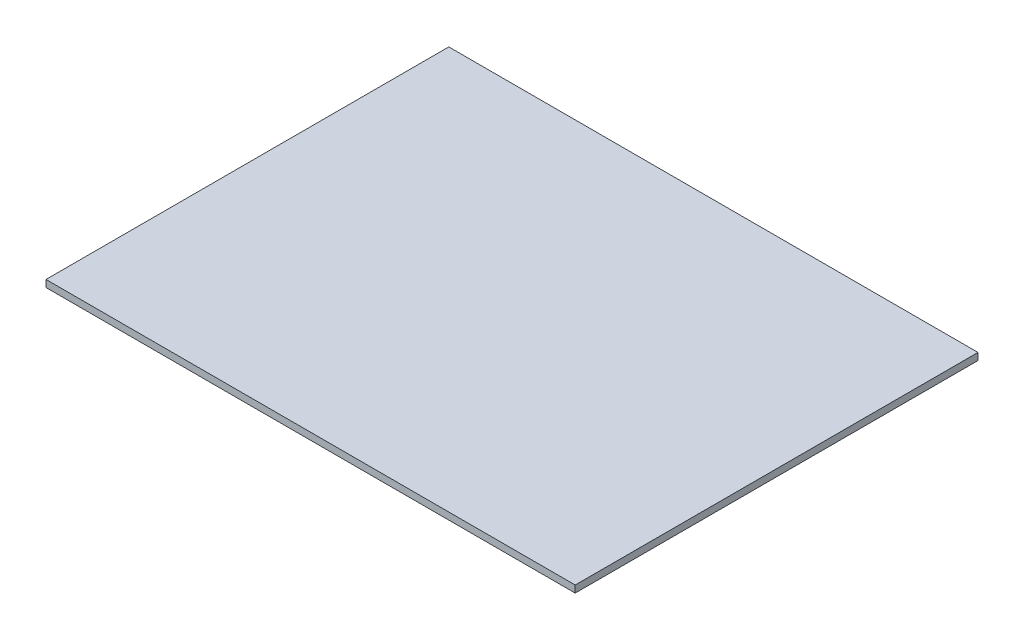
ISO-10303-21;
HEADER;
FILE_DESCRIPTION(('STEP AP214'),'2;1');
FILE_NAME('part.step','',(''),(''),'','','');
FILE_SCHEMA(('AUTOMOTIVE_DESIGN { 1 0 10303 214 1 1 1 1 }'));
ENDSEC;
DATA;
#1=APPLICATION_CONTEXT('core data for automotive mechanical design processes');
#2=APPLICATION_PROTOCOL_DEFINITION('international standard','automotive_design',2000,#1);
#3=PRODUCT_CONTEXT('',#1,'mechanical');
#4=PRODUCT('Part','Part','',(#3));
#5=PRODUCT_RELATED_PRODUCT_CATEGORY('part','',(#4));
#6=PRODUCT_DEFINITION_FORMATION('','',#4);
#7=PRODUCT_DEFINITION_CONTEXT('part definition',#1,'design');
#8=PRODUCT_DEFINITION('design','',#6,#7);
#9=PRODUCT_DEFINITION_SHAPE('','',#8);
#10=(LENGTH_UNIT() NAMED_UNIT(*) SI_UNIT(.MILLI.,.METRE.));
#11=(NAMED_UNIT(*) PLANE_ANGLE_UNIT() SI_UNIT($,.RADIAN.));
#12=(NAMED_UNIT(*) SI_UNIT($,.STERADIAN.) SOLID_ANGLE_UNIT());
#13=UNCERTAINTY_MEASURE_WITH_UNIT(LENGTH_MEASURE(1.E-05),#10,'distance_accuracy_value','');
#14=(GEOMETRIC_REPRESENTATION_CONTEXT(3) GLOBAL_UNCERTAINTY_ASSIGNED_CONTEXT((#13)) GLOBAL_UNIT_ASSIGNED_CONTEXT((#10,
#11,#12)) REPRESENTATION_CONTEXT('',''));
#15=CARTESIAN_POINT('',(0.,0.,0.));
#16=DIRECTION('',(0.,0.,1.));
#17=DIRECTION('',(1.,0.,0.));
#18=AXIS2_PLACEMENT_3D('',#15,#16,#17);
#19=CARTESIAN_POINT('',(75.35,2.,-57.35));
#20=DIRECTION('',(-1.,0.,0.));
#21=DIRECTION('',(0.,0.,1.));
#22=AXIS2_PLACEMENT_3D('',#19,#20,#21);
#23=PLANE('',#22);
#24=DIRECTION('',(0.,0.,-1.));
#25=VECTOR('',#24,1.);
#26=CARTESIAN_POINT('',(75.35,0.,-57.35));
#27=LINE('',#26,#25);
#28=CARTESIAN_POINT('',(75.35,0.,57.35));
#29=VERTEX_POINT('',#28);
#30=CARTESIAN_POINT('',(75.35,0.,-57.35));
#31=VERTEX_POINT('',#30);
#32=EDGE_CURVE('E96',#29,#31,#27,.T.);
#33=ORIENTED_EDGE('',*,*,#32,.T.);
#34=DIRECTION('',(0.,-1.,0.));
#35=VECTOR('',#34,1.);
#36=CARTESIAN_POINT('',(75.35,2.,-57.35));
#37=LINE('',#36,#35);
#38=CARTESIAN_POINT('',(75.35,2.,-57.35));
#39=VERTEX_POINT('',#38);
#40=EDGE_CURVE('E11',#39,#31,#37,.T.);
#41=ORIENTED_EDGE('',*,*,#40,.F.);
#42=DIRECTION('',(0.,0.,-1.));
#43=VECTOR('',#42,1.);
#44=CARTESIAN_POINT('',(75.35,2.,-57.35));
#45=LINE('',#44,#43);
#46=CARTESIAN_POINT('',(75.35,2.,57.35));
#47=VERTEX_POINT('',#46);
#48=EDGE_CURVE('E84',#47,#39,#45,.T.);
#49=ORIENTED_EDGE('',*,*,#48,.F.);
#50=DIRECTION('',(0.,-1.,0.));
#51=VECTOR('',#50,1.);
#52=CARTESIAN_POINT('',(75.35,2.,57.35));
#53=LINE('',#52,#51);
#54=EDGE_CURVE('E92',#47,#29,#53,.T.);
#55=ORIENTED_EDGE('',*,*,#54,.T.);
#56=EDGE_LOOP('',(#33,#41,#49,#55));
#57=FACE_BOUND('',#56,.T.);
#58=ADVANCED_FACE('F33',(#57),#23,.F.);
#59=CARTESIAN_POINT('',(-75.35,2.,-57.35));
#60=DIRECTION('',(0.,0.,1.));
#61=DIRECTION('',(1.,0.,0.));
#62=AXIS2_PLACEMENT_3D('',#59,#60,#61);
#63=PLANE('',#62);
#64=DIRECTION('',(-1.,0.,0.));
#65=VECTOR('',#64,1.);
#66=CARTESIAN_POINT('',(-75.35,0.,-57.35));
#67=LINE('',#66,#65);
#68=CARTESIAN_POINT('',(-75.35,0.,-57.35));
#69=VERTEX_POINT('',#68);
#70=EDGE_CURVE('E88',#31,#69,#67,.T.);
#71=ORIENTED_EDGE('',*,*,#70,.T.);
#72=DIRECTION('',(0.,-1.,0.));
#73=VECTOR('',#72,1.);
#74=CARTESIAN_POINT('',(-75.35,2.,-57.35));
#75=LINE('',#74,#73);
#76=CARTESIAN_POINT('',(-75.35,2.,-57.35));
#77=VERTEX_POINT('',#76);
#78=EDGE_CURVE('E41',#77,#69,#75,.T.);
#79=ORIENTED_EDGE('',*,*,#78,.F.);
#80=DIRECTION('',(-1.,0.,0.));
#81=VECTOR('',#80,1.);
#82=CARTESIAN_POINT('',(-75.35,2.,-57.35));
#83=LINE('',#82,#81);
#84=EDGE_CURVE('E79',#39,#77,#83,.T.);
#85=ORIENTED_EDGE('',*,*,#84,.F.);
#86=ORIENTED_EDGE('',*,*,#40,.T.);
#87=EDGE_LOOP('',(#71,#79,#85,#86));
#88=FACE_BOUND('',#87,.T.);
#89=ADVANCED_FACE('F87',(#88),#63,.F.);
#90=CARTESIAN_POINT('',(-75.35,2.,-57.35));
#91=DIRECTION('',(1.,0.,0.));
#92=DIRECTION('',(0.,0.,-1.));
#93=AXIS2_PLACEMENT_3D('',#90,#91,#92);
#94=PLANE('',#93);
#95=DIRECTION('',(0.,0.,1.));
#96=VECTOR('',#95,1.);
#97=CARTESIAN_POINT('',(-75.35,0.,-57.35));
#98=LINE('',#97,#96);
#99=CARTESIAN_POINT('',(-75.35,0.,57.35));
#100=VERTEX_POINT('',#99);
#101=EDGE_CURVE('E66',#69,#100,#98,.T.);
#102=ORIENTED_EDGE('',*,*,#101,.T.);
#103=DIRECTION('',(0.,-1.,0.));
#104=VECTOR('',#103,1.);
#105=CARTESIAN_POINT('',(-75.35,2.,57.35));
#106=LINE('',#105,#104);
#107=CARTESIAN_POINT('',(-75.35,2.,57.35));
#108=VERTEX_POINT('',#107);
#109=EDGE_CURVE('E89',#108,#100,#106,.T.);
#110=ORIENTED_EDGE('',*,*,#109,.F.);
#111=DIRECTION('',(0.,0.,1.));
#112=VECTOR('',#111,1.);
#113=CARTESIAN_POINT('',(-75.35,2.,-57.35));
#114=LINE('',#113,#112);
#115=EDGE_CURVE('E82',#77,#108,#114,.T.);
#116=ORIENTED_EDGE('',*,*,#115,.F.);
#117=ORIENTED_EDGE('',*,*,#78,.T.);
#118=EDGE_LOOP('',(#102,#110,#116,#117));
#119=FACE_BOUND('',#118,.T.);
#120=ADVANCED_FACE('F90',(#119),#94,.F.);
#121=CARTESIAN_POINT('',(-75.35,2.,57.35));
#122=DIRECTION('',(0.,0.,-1.));
#123=DIRECTION('',(-1.,0.,0.));
#124=AXIS2_PLACEMENT_3D('',#121,#122,#123);
#125=PLANE('',#124);
#126=DIRECTION('',(1.,0.,0.));
#127=VECTOR('',#126,1.);
#128=CARTESIAN_POINT('',(-75.35,0.,57.35));
#129=LINE('',#128,#127);
#130=EDGE_CURVE('E72',#100,#29,#129,.T.);
#131=ORIENTED_EDGE('',*,*,#130,.T.);
#132=ORIENTED_EDGE('',*,*,#54,.F.);
#133=DIRECTION('',(1.,0.,0.));
#134=VECTOR('',#133,1.);
#135=CARTESIAN_POINT('',(-75.35,2.,57.35));
#136=LINE('',#135,#134);
#137=EDGE_CURVE('E49',#108,#47,#136,.T.);
#138=ORIENTED_EDGE('',*,*,#137,.F.);
#139=ORIENTED_EDGE('',*,*,#109,.T.);
#140=EDGE_LOOP('',(#131,#132,#138,#139));
#141=FACE_BOUND('',#140,.T.);
#142=ADVANCED_FACE('F103',(#141),#125,.F.);
#143=CARTESIAN_POINT('',(0.,2.,0.));
#144=DIRECTION('',(0.,1.,0.));
#145=DIRECTION('',(0.,0.,1.));
#146=AXIS2_PLACEMENT_3D('',#143,#144,#145);
#147=PLANE('',#146);
#148=ORIENTED_EDGE('',*,*,#48,.T.);
#149=ORIENTED_EDGE('',*,*,#84,.T.);
#150=ORIENTED_EDGE('',*,*,#115,.T.);
#151=ORIENTED_EDGE('',*,*,#137,.T.);
#152=EDGE_LOOP('',(#148,#149,#150,#151));
#153=FACE_BOUND('',#152,.T.);
#154=ADVANCED_FACE('F80',(#153),#147,.T.);
#155=CARTESIAN_POINT('',(0.,0.,0.));
#156=DIRECTION('',(0.,1.,0.));
#157=DIRECTION('',(0.,0.,1.));
#158=AXIS2_PLACEMENT_3D('',#155,#156,#157);
#159=PLANE('',#158);
#160=ORIENTED_EDGE('',*,*,#32,.F.);
#161=ORIENTED_EDGE('',*,*,#130,.F.);
#162=ORIENTED_EDGE('',*,*,#101,.F.);
#163=ORIENTED_EDGE('',*,*,#70,.F.);
#164=EDGE_LOOP('',(#160,#161,#162,#163));
#165=FACE_BOUND('',#164,.T.);
#166=ADVANCED_FACE('F106',(#165),#159,.F.);
#167=CLOSED_SHELL('',(#58,#89,#120,#142,#154,#166));
#168=MANIFOLD_SOLID_BREP('B2',#167);
#169=ADVANCED_BREP_SHAPE_REPRESENTATION('',(#18,#168),#14);
#170=SHAPE_DEFINITION_REPRESENTATION(#9,#169);
ENDSEC;
END-ISO-10303-21;
